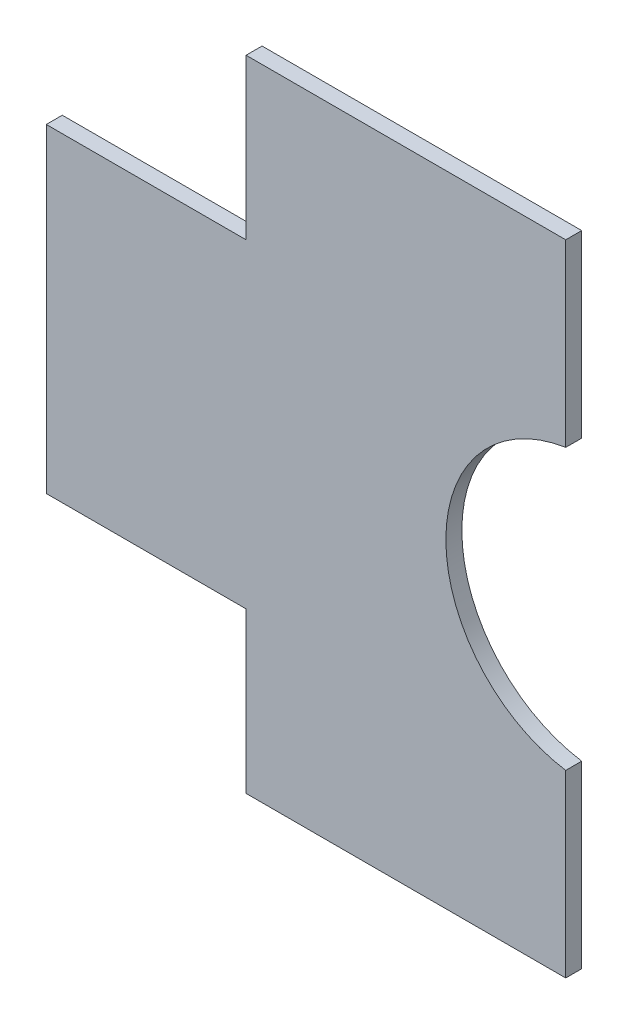
ISO-10303-21;
HEADER;
FILE_DESCRIPTION(('STEP AP214'),'2;1');
FILE_NAME('part.step','',(''),(''),'','','');
FILE_SCHEMA(('AUTOMOTIVE_DESIGN { 1 0 10303 214 1 1 1 1 }'));
ENDSEC;
DATA;
#1=APPLICATION_CONTEXT('core data for automotive mechanical design processes');
#2=APPLICATION_PROTOCOL_DEFINITION('international standard','automotive_design',2000,#1);
#3=PRODUCT_CONTEXT('',#1,'mechanical');
#4=PRODUCT('Part','Part','',(#3));
#5=PRODUCT_RELATED_PRODUCT_CATEGORY('part','',(#4));
#6=PRODUCT_DEFINITION_FORMATION('','',#4);
#7=PRODUCT_DEFINITION_CONTEXT('part definition',#1,'design');
#8=PRODUCT_DEFINITION('design','',#6,#7);
#9=PRODUCT_DEFINITION_SHAPE('','',#8);
#10=(LENGTH_UNIT() NAMED_UNIT(*) SI_UNIT(.MILLI.,.METRE.));
#11=(NAMED_UNIT(*) PLANE_ANGLE_UNIT() SI_UNIT($,.RADIAN.));
#12=(NAMED_UNIT(*) SI_UNIT($,.STERADIAN.) SOLID_ANGLE_UNIT());
#13=UNCERTAINTY_MEASURE_WITH_UNIT(LENGTH_MEASURE(1.E-05),#10,'distance_accuracy_value','');
#14=(GEOMETRIC_REPRESENTATION_CONTEXT(3) GLOBAL_UNCERTAINTY_ASSIGNED_CONTEXT((#13)) GLOBAL_UNIT_ASSIGNED_CONTEXT((#10,
#11,#12)) REPRESENTATION_CONTEXT('',''));
#15=CARTESIAN_POINT('',(0.,0.,0.));
#16=DIRECTION('',(0.,0.,1.));
#17=DIRECTION('',(1.,0.,0.));
#18=AXIS2_PLACEMENT_3D('',#15,#16,#17);
#19=CARTESIAN_POINT('',(20.534999999918,69.9579999998257,2.03325399955297));
#20=DIRECTION('',(0.,0.,1.));
#21=DIRECTION('',(1.,0.,0.));
#22=AXIS2_PLACEMENT_3D('',#19,#20,#21);
#23=PLANE('',#22);
#24=DIRECTION('',(-2.05103550980011E-10,-1.,0.));
#25=VECTOR('',#24,1.);
#26=CARTESIAN_POINT('',(19.884999999959,70.157999999959,2.03325399955297));
#27=LINE('',#26,#25);
#28=CARTESIAN_POINT('',(19.8849999999795,70.157999999959,2.03325399955297));
#29=VERTEX_POINT('',#28);
#30=CARTESIAN_POINT('',(19.885000000041,70.5579999999333,2.03325399955297));
#31=VERTEX_POINT('',#30);
#32=EDGE_CURVE('E179',#29,#31,#27,.F.);
#33=ORIENTED_EDGE('',*,*,#32,.F.);
#34=DIRECTION('',(1.,-2.05103550980011E-10,0.));
#35=VECTOR('',#34,1.);
#36=CARTESIAN_POINT('',(20.134999999959,70.1579999999077,2.03325399955297));
#37=LINE('',#36,#35);
#38=CARTESIAN_POINT('',(20.134999999959,70.1579999999205,2.03325399955297));
#39=VERTEX_POINT('',#38);
#40=EDGE_CURVE('E172',#39,#29,#37,.F.);
#41=ORIENTED_EDGE('',*,*,#40,.F.);
#42=DIRECTION('',(-2.05103550980011E-10,-1.,0.));
#43=VECTOR('',#42,1.);
#44=CARTESIAN_POINT('',(20.134999999918,69.9579999999077,2.03325399955297));
#45=LINE('',#44,#43);
#46=CARTESIAN_POINT('',(20.134999999918,69.9579999999077,2.03325399955297));
#47=VERTEX_POINT('',#46);
#48=EDGE_CURVE('E138',#47,#39,#45,.F.);
#49=ORIENTED_EDGE('',*,*,#48,.F.);
#50=DIRECTION('',(1.,-2.05103550980011E-10,0.));
#51=VECTOR('',#50,1.);
#52=CARTESIAN_POINT('',(20.534999999918,69.9579999998257,2.03325399955297));
#53=LINE('',#52,#51);
#54=CARTESIAN_POINT('',(20.534999999918,69.9579999998257,2.03325399955297));
#55=VERTEX_POINT('',#54);
#56=EDGE_CURVE('E131',#55,#47,#53,.F.);
#57=ORIENTED_EDGE('',*,*,#56,.F.);
#58=DIRECTION('',(2.05103550980011E-10,1.,0.));
#59=VECTOR('',#58,1.);
#60=CARTESIAN_POINT('',(20.5349999999641,70.1829999998257,2.03325399955297));
#61=LINE('',#60,#59);
#62=CARTESIAN_POINT('',(20.5349999999641,70.1829999998259,2.03325399955297));
#63=VERTEX_POINT('',#62);
#64=EDGE_CURVE('E91',#63,#55,#61,.F.);
#65=ORIENTED_EDGE('',*,*,#64,.F.);
#66=CARTESIAN_POINT('',(20.562083333333,70.3579999998201,2.03325399955297));
#67=DIRECTION('',(0.,0.,1.));
#68=DIRECTION('',(1.,0.,0.));
#69=AXIS2_PLACEMENT_3D('',#66,#67,#68);
#70=CIRCLE('',#69,0.177083333333);
#71=CARTESIAN_POINT('',(20.5350000000359,70.5329999998254,2.03325399955297));
#72=VERTEX_POINT('',#71);
#73=EDGE_CURVE('E20',#63,#72,#70,.F.);
#74=ORIENTED_EDGE('',*,*,#73,.T.);
#75=DIRECTION('',(2.05103550980011E-10,1.,0.));
#76=VECTOR('',#75,1.);
#77=CARTESIAN_POINT('',(20.535000000082,70.7579999998257,2.03325399955297));
#78=LINE('',#77,#76);
#79=CARTESIAN_POINT('',(20.5350000000743,70.7579999998257,2.03325399955297));
#80=VERTEX_POINT('',#79);
#81=EDGE_CURVE('E94',#80,#72,#78,.F.);
#82=ORIENTED_EDGE('',*,*,#81,.F.);
#83=DIRECTION('',(-1.,2.05103550980011E-10,0.));
#84=VECTOR('',#83,1.);
#85=CARTESIAN_POINT('',(20.135000000082,70.7579999999077,2.03325399955297));
#86=LINE('',#85,#84);
#87=CARTESIAN_POINT('',(20.135000000082,70.7579999998872,2.03325399955297));
#88=VERTEX_POINT('',#87);
#89=EDGE_CURVE('E125',#88,#80,#86,.F.);
#90=ORIENTED_EDGE('',*,*,#89,.F.);
#91=DIRECTION('',(-2.05103550980011E-10,-1.,0.));
#92=VECTOR('',#91,1.);
#93=CARTESIAN_POINT('',(20.135000000041,70.5579999999077,2.03325399955297));
#94=LINE('',#93,#92);
#95=CARTESIAN_POINT('',(20.1350000000512,70.5579999999077,2.03325399955297));
#96=VERTEX_POINT('',#95);
#97=EDGE_CURVE('E185',#96,#88,#94,.F.);
#98=ORIENTED_EDGE('',*,*,#97,.F.);
#99=DIRECTION('',(-1.,2.05103550980011E-10,0.));
#100=VECTOR('',#99,1.);
#101=CARTESIAN_POINT('',(19.885000000041,70.557999999959,2.03325399955297));
#102=LINE('',#101,#100);
#103=EDGE_CURVE('E181',#31,#96,#102,.F.);
#104=ORIENTED_EDGE('',*,*,#103,.F.);
#105=EDGE_LOOP('',(#33,#41,#49,#57,#65,#74,#82,#90,#98,#104));
#106=FACE_BOUND('',#105,.T.);
#107=ADVANCED_FACE('F17',(#106),#23,.T.);
#108=CARTESIAN_POINT('',(20.534999999918,69.9579999998257,2.013254));
#109=DIRECTION('',(-2.05103550980011E-10,-1.,0.));
#110=DIRECTION('',(1.,-2.05103550980011E-10,0.));
#111=AXIS2_PLACEMENT_3D('',#108,#109,#110);
#112=PLANE('',#111);
#113=DIRECTION('',(0.,0.,1.));
#114=VECTOR('',#113,1.);
#115=CARTESIAN_POINT('',(20.534999999918,69.9579999998257,2.013254));
#116=LINE('',#115,#114);
#117=CARTESIAN_POINT('',(20.534999999918,69.9579999998804,2.013254));
#118=VERTEX_POINT('',#117);
#119=EDGE_CURVE('E129',#55,#118,#116,.F.);
#120=ORIENTED_EDGE('',*,*,#119,.F.);
#121=ORIENTED_EDGE('',*,*,#56,.T.);
#122=DIRECTION('',(0.,0.,1.));
#123=VECTOR('',#122,1.);
#124=CARTESIAN_POINT('',(20.134999999918,69.9579999999077,2.013254));
#125=LINE('',#124,#123);
#126=CARTESIAN_POINT('',(20.1349999999385,69.9579999999077,2.013254));
#127=VERTEX_POINT('',#126);
#128=EDGE_CURVE('E141',#127,#47,#125,.T.);
#129=ORIENTED_EDGE('',*,*,#128,.F.);
#130=DIRECTION('',(1.,0.,0.));
#131=VECTOR('',#130,1.);
#132=CARTESIAN_POINT('',(20.534999999918,69.9579999999077,2.013254));
#133=LINE('',#132,#131);
#134=EDGE_CURVE('E134',#127,#118,#133,.T.);
#135=ORIENTED_EDGE('',*,*,#134,.T.);
#136=EDGE_LOOP('',(#120,#121,#129,#135));
#137=FACE_BOUND('',#136,.T.);
#138=ADVANCED_FACE('F224',(#137),#112,.T.);
#139=CARTESIAN_POINT('',(20.5349999999641,70.1829999998257,2.013254));
#140=DIRECTION('',(1.,-2.05103550980011E-10,0.));
#141=DIRECTION('',(2.05103550980011E-10,1.,0.));
#142=AXIS2_PLACEMENT_3D('',#139,#140,#141);
#143=PLANE('',#142);
#144=DIRECTION('',(0.,0.,1.));
#145=VECTOR('',#144,1.);
#146=CARTESIAN_POINT('',(20.5349999999641,70.1829999998259,2.013254));
#147=LINE('',#146,#145);
#148=CARTESIAN_POINT('',(20.534999999941,70.1829999998295,2.013254));
#149=VERTEX_POINT('',#148);
#150=EDGE_CURVE('E100',#149,#63,#147,.T.);
#151=ORIENTED_EDGE('',*,*,#150,.T.);
#152=ORIENTED_EDGE('',*,*,#64,.T.);
#153=ORIENTED_EDGE('',*,*,#119,.T.);
#154=DIRECTION('',(0.,1.,0.));
#155=VECTOR('',#154,1.);
#156=CARTESIAN_POINT('',(20.534999999918,69.9579999998257,2.013254));
#157=LINE('',#156,#155);
#158=EDGE_CURVE('E137',#118,#149,#157,.T.);
#159=ORIENTED_EDGE('',*,*,#158,.T.);
#160=EDGE_LOOP('',(#151,#152,#153,#159));
#161=FACE_BOUND('',#160,.T.);
#162=ADVANCED_FACE('F225',(#161),#143,.T.);
#163=CARTESIAN_POINT('',(20.562083333333,70.3579999998201,2.013254));
#164=DIRECTION('',(0.,0.,1.));
#165=DIRECTION('',(1.,0.,0.));
#166=AXIS2_PLACEMENT_3D('',#163,#164,#165);
#167=CYLINDRICAL_SURFACE('',#166,0.177083333333);
#168=ORIENTED_EDGE('',*,*,#150,.F.);
#169=CARTESIAN_POINT('',(20.562083333333,70.3579999998201,2.013254));
#170=DIRECTION('',(0.,0.,1.));
#171=DIRECTION('',(1.,0.,0.));
#172=AXIS2_PLACEMENT_3D('',#169,#170,#171);
#173=CIRCLE('',#172,0.177083333333);
#174=CARTESIAN_POINT('',(20.5350000000359,70.5329999998254,2.013254));
#175=VERTEX_POINT('',#174);
#176=EDGE_CURVE('E111',#149,#175,#173,.F.);
#177=ORIENTED_EDGE('',*,*,#176,.T.);
#178=DIRECTION('',(0.,0.,1.));
#179=VECTOR('',#178,1.);
#180=CARTESIAN_POINT('',(20.5350000000359,70.5329999998255,2.013254));
#181=LINE('',#180,#179);
#182=EDGE_CURVE('E99',#72,#175,#181,.F.);
#183=ORIENTED_EDGE('',*,*,#182,.F.);
#184=ORIENTED_EDGE('',*,*,#73,.F.);
#185=EDGE_LOOP('',(#168,#177,#183,#184));
#186=FACE_BOUND('',#185,.T.);
#187=ADVANCED_FACE('F109',(#186),#167,.F.);
#188=CARTESIAN_POINT('',(20.535000000082,70.7579999998257,2.013254));
#189=DIRECTION('',(1.,-2.05103550980011E-10,0.));
#190=DIRECTION('',(2.05103550980011E-10,1.,0.));
#191=AXIS2_PLACEMENT_3D('',#188,#189,#190);
#192=PLANE('',#191);
#193=DIRECTION('',(0.,0.,1.));
#194=VECTOR('',#193,1.);
#195=CARTESIAN_POINT('',(20.535000000082,70.7579999998257,2.013254));
#196=LINE('',#195,#194);
#197=CARTESIAN_POINT('',(20.5350000000513,70.7579999998257,2.013254));
#198=VERTEX_POINT('',#197);
#199=EDGE_CURVE('E106',#80,#198,#196,.F.);
#200=ORIENTED_EDGE('',*,*,#199,.F.);
#201=ORIENTED_EDGE('',*,*,#81,.T.);
#202=ORIENTED_EDGE('',*,*,#182,.T.);
#203=DIRECTION('',(0.,1.,0.));
#204=VECTOR('',#203,1.);
#205=CARTESIAN_POINT('',(20.5350000000359,69.9579999998257,2.013254));
#206=LINE('',#205,#204);
#207=EDGE_CURVE('E121',#175,#198,#206,.T.);
#208=ORIENTED_EDGE('',*,*,#207,.T.);
#209=EDGE_LOOP('',(#200,#201,#202,#208));
#210=FACE_BOUND('',#209,.T.);
#211=ADVANCED_FACE('F103',(#210),#192,.T.);
#212=CARTESIAN_POINT('',(20.135000000082,70.7579999999077,2.013254));
#213=DIRECTION('',(2.05103550980011E-10,1.,0.));
#214=DIRECTION('',(-1.,2.05103550980011E-10,0.));
#215=AXIS2_PLACEMENT_3D('',#212,#213,#214);
#216=PLANE('',#215);
#217=DIRECTION('',(0.,0.,1.));
#218=VECTOR('',#217,1.);
#219=CARTESIAN_POINT('',(20.135000000082,70.7579999999077,2.013254));
#220=LINE('',#219,#218);
#221=CARTESIAN_POINT('',(20.135000000082,70.7579999998872,2.013254));
#222=VERTEX_POINT('',#221);
#223=EDGE_CURVE('E115',#88,#222,#220,.F.);
#224=ORIENTED_EDGE('',*,*,#223,.F.);
#225=ORIENTED_EDGE('',*,*,#89,.T.);
#226=ORIENTED_EDGE('',*,*,#199,.T.);
#227=DIRECTION('',(1.,0.,0.));
#228=VECTOR('',#227,1.);
#229=CARTESIAN_POINT('',(20.534999999918,70.7579999998257,2.013254));
#230=LINE('',#229,#228);
#231=EDGE_CURVE('E117',#198,#222,#230,.F.);
#232=ORIENTED_EDGE('',*,*,#231,.T.);
#233=EDGE_LOOP('',(#224,#225,#226,#232));
#234=FACE_BOUND('',#233,.T.);
#235=ADVANCED_FACE('F203',(#234),#216,.T.);
#236=CARTESIAN_POINT('',(20.135000000041,70.5579999999077,2.013254));
#237=DIRECTION('',(-1.,2.05103550980011E-10,0.));
#238=DIRECTION('',(-2.05103550980011E-10,-1.,0.));
#239=AXIS2_PLACEMENT_3D('',#236,#237,#238);
#240=PLANE('',#239);
#241=DIRECTION('',(0.,0.,1.));
#242=VECTOR('',#241,1.);
#243=CARTESIAN_POINT('',(20.135000000041,70.5579999999077,2.013254));
#244=LINE('',#243,#242);
#245=CARTESIAN_POINT('',(20.1350000000512,70.5579999999077,2.013254));
#246=VERTEX_POINT('',#245);
#247=EDGE_CURVE('E184',#96,#246,#244,.F.);
#248=ORIENTED_EDGE('',*,*,#247,.F.);
#249=ORIENTED_EDGE('',*,*,#97,.T.);
#250=ORIENTED_EDGE('',*,*,#223,.T.);
#251=DIRECTION('',(0.,1.,0.));
#252=VECTOR('',#251,1.);
#253=CARTESIAN_POINT('',(20.135000000082,69.9579999998257,2.013254));
#254=LINE('',#253,#252);
#255=EDGE_CURVE('E120',#222,#246,#254,.F.);
#256=ORIENTED_EDGE('',*,*,#255,.T.);
#257=EDGE_LOOP('',(#248,#249,#250,#256));
#258=FACE_BOUND('',#257,.T.);
#259=ADVANCED_FACE('F192',(#258),#240,.T.);
#260=CARTESIAN_POINT('',(19.885000000041,70.557999999959,2.013254));
#261=DIRECTION('',(2.05103550980011E-10,1.,0.));
#262=DIRECTION('',(-1.,2.05103550980011E-10,0.));
#263=AXIS2_PLACEMENT_3D('',#260,#261,#262);
#264=PLANE('',#263);
#265=DIRECTION('',(0.,0.,1.));
#266=VECTOR('',#265,1.);
#267=CARTESIAN_POINT('',(19.885000000041,70.557999999959,2.013254));
#268=LINE('',#267,#266);
#269=CARTESIAN_POINT('',(19.885000000041,70.5579999999462,2.013254));
#270=VERTEX_POINT('',#269);
#271=EDGE_CURVE('E177',#31,#270,#268,.F.);
#272=ORIENTED_EDGE('',*,*,#271,.F.);
#273=ORIENTED_EDGE('',*,*,#103,.T.);
#274=ORIENTED_EDGE('',*,*,#247,.T.);
#275=DIRECTION('',(1.,0.,0.));
#276=VECTOR('',#275,1.);
#277=CARTESIAN_POINT('',(20.534999999918,70.5579999999077,2.013254));
#278=LINE('',#277,#276);
#279=EDGE_CURVE('E201',#246,#270,#278,.F.);
#280=ORIENTED_EDGE('',*,*,#279,.T.);
#281=EDGE_LOOP('',(#272,#273,#274,#280));
#282=FACE_BOUND('',#281,.T.);
#283=ADVANCED_FACE('F207',(#282),#264,.T.);
#284=CARTESIAN_POINT('',(19.884999999959,70.157999999959,2.013254));
#285=DIRECTION('',(-1.,2.05103550980011E-10,0.));
#286=DIRECTION('',(-2.05103550980011E-10,-1.,0.));
#287=AXIS2_PLACEMENT_3D('',#284,#285,#286);
#288=PLANE('',#287);
#289=DIRECTION('',(0.,1.,0.));
#290=VECTOR('',#289,1.);
#291=CARTESIAN_POINT('',(19.885000000041,69.9579999998257,2.013254));
#292=LINE('',#291,#290);
#293=CARTESIAN_POINT('',(19.8849999999795,70.157999999959,2.013254));
#294=VERTEX_POINT('',#293);
#295=EDGE_CURVE('E212',#270,#294,#292,.F.);
#296=ORIENTED_EDGE('',*,*,#295,.T.);
#297=DIRECTION('',(0.,0.,1.));
#298=VECTOR('',#297,1.);
#299=CARTESIAN_POINT('',(19.884999999959,70.157999999959,2.013254));
#300=LINE('',#299,#298);
#301=EDGE_CURVE('E175',#29,#294,#300,.F.);
#302=ORIENTED_EDGE('',*,*,#301,.F.);
#303=ORIENTED_EDGE('',*,*,#32,.T.);
#304=ORIENTED_EDGE('',*,*,#271,.T.);
#305=EDGE_LOOP('',(#296,#302,#303,#304));
#306=FACE_BOUND('',#305,.T.);
#307=ADVANCED_FACE('F210',(#306),#288,.T.);
#308=CARTESIAN_POINT('',(20.134999999959,70.1579999999077,2.013254));
#309=DIRECTION('',(-2.05103550980011E-10,-1.,0.));
#310=DIRECTION('',(1.,-2.05103550980011E-10,0.));
#311=AXIS2_PLACEMENT_3D('',#308,#309,#310);
#312=PLANE('',#311);
#313=DIRECTION('',(0.,0.,1.));
#314=VECTOR('',#313,1.);
#315=CARTESIAN_POINT('',(20.134999999959,70.1579999999077,2.013254));
#316=LINE('',#315,#314);
#317=CARTESIAN_POINT('',(20.134999999959,70.1579999999205,2.013254));
#318=VERTEX_POINT('',#317);
#319=EDGE_CURVE('E34',#39,#318,#316,.F.);
#320=ORIENTED_EDGE('',*,*,#319,.F.);
#321=ORIENTED_EDGE('',*,*,#40,.T.);
#322=ORIENTED_EDGE('',*,*,#301,.T.);
#323=DIRECTION('',(1.,0.,0.));
#324=VECTOR('',#323,1.);
#325=CARTESIAN_POINT('',(20.534999999918,70.157999999959,2.013254));
#326=LINE('',#325,#324);
#327=EDGE_CURVE('E26',#294,#318,#326,.T.);
#328=ORIENTED_EDGE('',*,*,#327,.T.);
#329=EDGE_LOOP('',(#320,#321,#322,#328));
#330=FACE_BOUND('',#329,.T.);
#331=ADVANCED_FACE('F218',(#330),#312,.T.);
#332=CARTESIAN_POINT('',(20.134999999918,69.9579999999077,2.013254));
#333=DIRECTION('',(-1.,2.05103550980011E-10,0.));
#334=DIRECTION('',(-2.05103550980011E-10,-1.,0.));
#335=AXIS2_PLACEMENT_3D('',#332,#333,#334);
#336=PLANE('',#335);
#337=ORIENTED_EDGE('',*,*,#128,.T.);
#338=ORIENTED_EDGE('',*,*,#48,.T.);
#339=ORIENTED_EDGE('',*,*,#319,.T.);
#340=DIRECTION('',(0.,1.,0.));
#341=VECTOR('',#340,1.);
#342=CARTESIAN_POINT('',(20.134999999959,69.9579999998257,2.013254));
#343=LINE('',#342,#341);
#344=EDGE_CURVE('E11',#318,#127,#343,.F.);
#345=ORIENTED_EDGE('',*,*,#344,.T.);
#346=EDGE_LOOP('',(#337,#338,#339,#345));
#347=FACE_BOUND('',#346,.T.);
#348=ADVANCED_FACE('F220',(#347),#336,.T.);
#349=CARTESIAN_POINT('',(20.534999999918,69.9579999998257,2.013254));
#350=DIRECTION('',(0.,0.,1.));
#351=DIRECTION('',(1.,0.,0.));
#352=AXIS2_PLACEMENT_3D('',#349,#350,#351);
#353=PLANE('',#352);
#354=ORIENTED_EDGE('',*,*,#327,.F.);
#355=ORIENTED_EDGE('',*,*,#295,.F.);
#356=ORIENTED_EDGE('',*,*,#279,.F.);
#357=ORIENTED_EDGE('',*,*,#255,.F.);
#358=ORIENTED_EDGE('',*,*,#231,.F.);
#359=ORIENTED_EDGE('',*,*,#207,.F.);
#360=ORIENTED_EDGE('',*,*,#176,.F.);
#361=ORIENTED_EDGE('',*,*,#158,.F.);
#362=ORIENTED_EDGE('',*,*,#134,.F.);
#363=ORIENTED_EDGE('',*,*,#344,.F.);
#364=EDGE_LOOP('',(#354,#355,#356,#357,#358,#359,#360,#361,#362,#363));
#365=FACE_BOUND('',#364,.T.);
#366=ADVANCED_FACE('F198',(#365),#353,.F.);
#367=CLOSED_SHELL('',(#107,#138,#162,#187,#211,#235,#259,#283,#307,#331,#348,#366));
#368=MANIFOLD_SOLID_BREP('B1',#367);
#369=ADVANCED_BREP_SHAPE_REPRESENTATION('',(#18,#368),#14);
#370=SHAPE_DEFINITION_REPRESENTATION(#9,#369);
ENDSEC;
END-ISO-10303-21;
